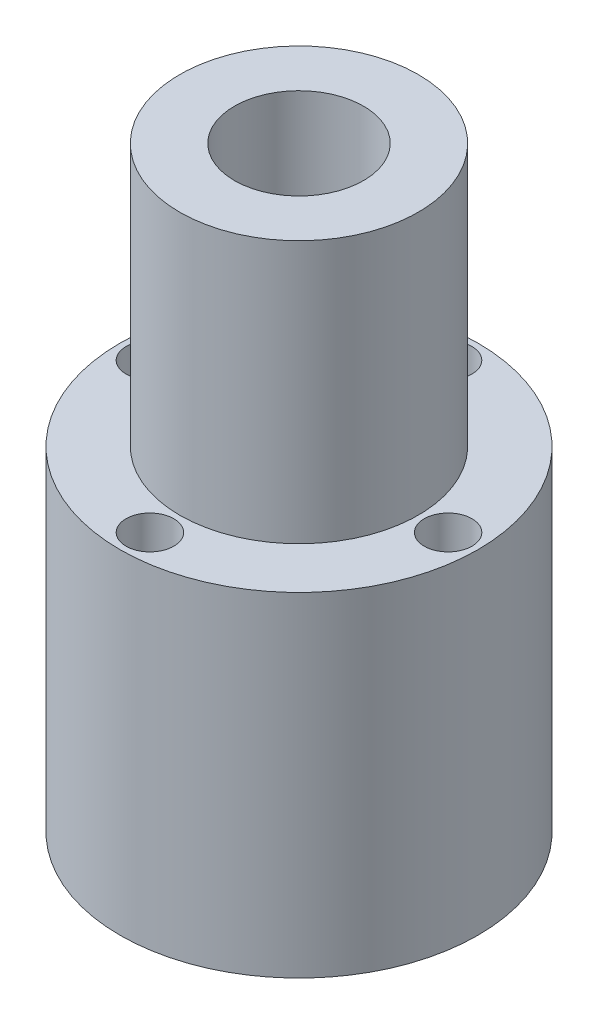
ISO-10303-21;
HEADER;
FILE_DESCRIPTION(('STEP AP214'),'2;1');
FILE_NAME('part.step','',(''),(''),'','','');
FILE_SCHEMA(('AUTOMOTIVE_DESIGN { 1 0 10303 214 1 1 1 1 }'));
ENDSEC;
DATA;
#1=APPLICATION_CONTEXT('core data for automotive mechanical design processes');
#2=APPLICATION_PROTOCOL_DEFINITION('international standard','automotive_design',2000,#1);
#3=PRODUCT_CONTEXT('',#1,'mechanical');
#4=PRODUCT('Part','Part','',(#3));
#5=PRODUCT_RELATED_PRODUCT_CATEGORY('part','',(#4));
#6=PRODUCT_DEFINITION_FORMATION('','',#4);
#7=PRODUCT_DEFINITION_CONTEXT('part definition',#1,'design');
#8=PRODUCT_DEFINITION('design','',#6,#7);
#9=PRODUCT_DEFINITION_SHAPE('','',#8);
#10=(LENGTH_UNIT() NAMED_UNIT(*) SI_UNIT(.MILLI.,.METRE.));
#11=(NAMED_UNIT(*) PLANE_ANGLE_UNIT() SI_UNIT($,.RADIAN.));
#12=(NAMED_UNIT(*) SI_UNIT($,.STERADIAN.) SOLID_ANGLE_UNIT());
#13=UNCERTAINTY_MEASURE_WITH_UNIT(LENGTH_MEASURE(1.E-05),#10,'distance_accuracy_value','');
#14=(GEOMETRIC_REPRESENTATION_CONTEXT(3) GLOBAL_UNCERTAINTY_ASSIGNED_CONTEXT((#13)) GLOBAL_UNIT_ASSIGNED_CONTEXT((#10,
#11,#12)) REPRESENTATION_CONTEXT('',''));
#15=CARTESIAN_POINT('',(0.,0.,0.));
#16=DIRECTION('',(0.,0.,1.));
#17=DIRECTION('',(1.,0.,0.));
#18=AXIS2_PLACEMENT_3D('',#15,#16,#17);
#19=CARTESIAN_POINT('',(0.,11.,0.));
#20=DIRECTION('',(0.,1.,0.));
#21=DIRECTION('',(0.,0.,1.));
#22=AXIS2_PLACEMENT_3D('',#19,#20,#21);
#23=PLANE('',#22);
#24=CARTESIAN_POINT('',(0.,11.,0.));
#25=DIRECTION('',(0.,1.,0.));
#26=DIRECTION('',(0.,0.,1.));
#27=AXIS2_PLACEMENT_3D('',#24,#25,#26);
#28=CIRCLE('',#27,5.);
#29=CARTESIAN_POINT('',(0.,11.,5.));
#30=VERTEX_POINT('',#29);
#31=EDGE_CURVE('E10',#30,#30,#28,.T.);
#32=ORIENTED_EDGE('',*,*,#31,.T.);
#33=EDGE_LOOP('',(#32));
#34=FACE_BOUND('',#33,.T.);
#35=CARTESIAN_POINT('',(0.,11.,0.));
#36=DIRECTION('',(0.,1.,0.));
#37=DIRECTION('',(0.,0.,1.));
#38=AXIS2_PLACEMENT_3D('',#35,#36,#37);
#39=CIRCLE('',#38,2.7051);
#40=CARTESIAN_POINT('',(0.,11.,2.7051));
#41=VERTEX_POINT('',#40);
#42=EDGE_CURVE('E39',#41,#41,#39,.T.);
#43=ORIENTED_EDGE('',*,*,#42,.F.);
#44=EDGE_LOOP('',(#43));
#45=FACE_BOUND('',#44,.T.);
#46=ADVANCED_FACE('F31',(#34,#45),#23,.T.);
#47=CARTESIAN_POINT('',(0.,11.,0.));
#48=DIRECTION('',(0.,-1.,0.));
#49=DIRECTION('',(0.,0.,-1.));
#50=AXIS2_PLACEMENT_3D('',#47,#48,#49);
#51=CYLINDRICAL_SURFACE('',#50,5.);
#52=ORIENTED_EDGE('',*,*,#31,.F.);
#53=EDGE_LOOP('',(#52));
#54=FACE_BOUND('',#53,.T.);
#55=CARTESIAN_POINT('',(0.,0.,0.));
#56=DIRECTION('',(0.,1.,0.));
#57=DIRECTION('',(0.,0.,1.));
#58=AXIS2_PLACEMENT_3D('',#55,#56,#57);
#59=CIRCLE('',#58,5.);
#60=CARTESIAN_POINT('',(0.,0.,5.));
#61=VERTEX_POINT('',#60);
#62=EDGE_CURVE('E47',#61,#61,#59,.T.);
#63=ORIENTED_EDGE('',*,*,#62,.T.);
#64=EDGE_LOOP('',(#63));
#65=FACE_BOUND('',#64,.T.);
#66=ADVANCED_FACE('F33',(#54,#65),#51,.T.);
#67=CARTESIAN_POINT('',(0.,11.,0.));
#68=DIRECTION('',(0.,-1.,0.));
#69=DIRECTION('',(0.,0.,-1.));
#70=AXIS2_PLACEMENT_3D('',#67,#68,#69);
#71=CYLINDRICAL_SURFACE('',#70,2.7051);
#72=ORIENTED_EDGE('',*,*,#42,.T.);
#73=EDGE_LOOP('',(#72));
#74=FACE_BOUND('',#73,.T.);
#75=CARTESIAN_POINT('',(0.,0.,0.));
#76=DIRECTION('',(0.,1.,0.));
#77=DIRECTION('',(0.,0.,1.));
#78=AXIS2_PLACEMENT_3D('',#75,#76,#77);
#79=CIRCLE('',#78,2.7051);
#80=CARTESIAN_POINT('',(0.,0.,2.7051));
#81=VERTEX_POINT('',#80);
#82=EDGE_CURVE('E44',#81,#81,#79,.T.);
#83=ORIENTED_EDGE('',*,*,#82,.F.);
#84=EDGE_LOOP('',(#83));
#85=FACE_BOUND('',#84,.T.);
#86=ADVANCED_FACE('F119',(#74,#85),#71,.F.);
#87=CARTESIAN_POINT('',(0.,0.,0.));
#88=DIRECTION('',(0.,1.,0.));
#89=DIRECTION('',(0.,0.,1.));
#90=AXIS2_PLACEMENT_3D('',#87,#88,#89);
#91=PLANE('',#90);
#92=CARTESIAN_POINT('',(0.,0.,0.));
#93=DIRECTION('',(0.,1.,0.));
#94=DIRECTION('',(0.,0.,1.));
#95=AXIS2_PLACEMENT_3D('',#92,#93,#94);
#96=CIRCLE('',#95,1.75);
#97=CARTESIAN_POINT('',(0.,0.,1.75));
#98=VERTEX_POINT('',#97);
#99=EDGE_CURVE('E59',#98,#98,#96,.T.);
#100=ORIENTED_EDGE('',*,*,#99,.F.);
#101=EDGE_LOOP('',(#100));
#102=FACE_BOUND('',#101,.T.);
#103=ORIENTED_EDGE('',*,*,#82,.T.);
#104=EDGE_LOOP('',(#103));
#105=FACE_BOUND('',#104,.T.);
#106=ADVANCED_FACE('F125',(#102,#105),#91,.T.);
#107=CARTESIAN_POINT('',(0.,-14.,0.));
#108=DIRECTION('',(0.,1.,0.));
#109=DIRECTION('',(0.,0.,1.));
#110=AXIS2_PLACEMENT_3D('',#107,#108,#109);
#111=CYLINDRICAL_SURFACE('',#110,7.5);
#112=CARTESIAN_POINT('',(0.,-14.,0.));
#113=DIRECTION('',(0.,1.,0.));
#114=DIRECTION('',(0.,0.,1.));
#115=AXIS2_PLACEMENT_3D('',#112,#113,#114);
#116=CIRCLE('',#115,7.5);
#117=CARTESIAN_POINT('',(0.,-14.,7.5));
#118=VERTEX_POINT('',#117);
#119=EDGE_CURVE('E49',#118,#118,#116,.T.);
#120=ORIENTED_EDGE('',*,*,#119,.T.);
#121=EDGE_LOOP('',(#120));
#122=FACE_BOUND('',#121,.T.);
#123=CARTESIAN_POINT('',(0.,0.,0.));
#124=DIRECTION('',(0.,1.,0.));
#125=DIRECTION('',(0.,0.,1.));
#126=AXIS2_PLACEMENT_3D('',#123,#124,#125);
#127=CIRCLE('',#126,7.5);
#128=CARTESIAN_POINT('',(0.,0.,7.5));
#129=VERTEX_POINT('',#128);
#130=EDGE_CURVE('E54',#129,#129,#127,.T.);
#131=ORIENTED_EDGE('',*,*,#130,.F.);
#132=EDGE_LOOP('',(#131));
#133=FACE_BOUND('',#132,.T.);
#134=ADVANCED_FACE('F127',(#122,#133),#111,.T.);
#135=CARTESIAN_POINT('',(0.,-14.,0.));
#136=DIRECTION('',(0.,1.,0.));
#137=DIRECTION('',(0.,0.,1.));
#138=AXIS2_PLACEMENT_3D('',#135,#136,#137);
#139=PLANE('',#138);
#140=CARTESIAN_POINT('',(0.,-14.,0.));
#141=DIRECTION('',(0.,1.,0.));
#142=DIRECTION('',(0.,0.,1.));
#143=AXIS2_PLACEMENT_3D('',#140,#141,#142);
#144=CIRCLE('',#143,2.1);
#145=CARTESIAN_POINT('',(0.,-14.,2.1));
#146=VERTEX_POINT('',#145);
#147=EDGE_CURVE('E88',#146,#146,#144,.T.);
#148=ORIENTED_EDGE('',*,*,#147,.T.);
#149=EDGE_LOOP('',(#148));
#150=FACE_BOUND('',#149,.T.);
#151=CARTESIAN_POINT('',(-6.25,-14.,0.));
#152=DIRECTION('',(0.,1.,0.));
#153=DIRECTION('',(0.,0.,1.));
#154=AXIS2_PLACEMENT_3D('',#151,#152,#153);
#155=CIRCLE('',#154,1.);
#156=CARTESIAN_POINT('',(-6.25,-14.,1.));
#157=VERTEX_POINT('',#156);
#158=EDGE_CURVE('E80',#157,#157,#155,.T.);
#159=ORIENTED_EDGE('',*,*,#158,.T.);
#160=EDGE_LOOP('',(#159));
#161=FACE_BOUND('',#160,.T.);
#162=CARTESIAN_POINT('',(0.,-14.,6.25));
#163=DIRECTION('',(0.,1.,0.));
#164=DIRECTION('',(0.,0.,1.));
#165=AXIS2_PLACEMENT_3D('',#162,#163,#164);
#166=CIRCLE('',#165,1.);
#167=CARTESIAN_POINT('',(0.,-14.,7.25));
#168=VERTEX_POINT('',#167);
#169=EDGE_CURVE('E74',#168,#168,#166,.T.);
#170=ORIENTED_EDGE('',*,*,#169,.T.);
#171=EDGE_LOOP('',(#170));
#172=FACE_BOUND('',#171,.T.);
#173=CARTESIAN_POINT('',(6.25,-14.,0.));
#174=DIRECTION('',(0.,1.,0.));
#175=DIRECTION('',(0.,0.,1.));
#176=AXIS2_PLACEMENT_3D('',#173,#174,#175);
#177=CIRCLE('',#176,1.);
#178=CARTESIAN_POINT('',(6.25,-14.,1.));
#179=VERTEX_POINT('',#178);
#180=EDGE_CURVE('E68',#179,#179,#177,.T.);
#181=ORIENTED_EDGE('',*,*,#180,.T.);
#182=EDGE_LOOP('',(#181));
#183=FACE_BOUND('',#182,.T.);
#184=CARTESIAN_POINT('',(0.,-14.,-6.25));
#185=DIRECTION('',(0.,1.,0.));
#186=DIRECTION('',(0.,0.,1.));
#187=AXIS2_PLACEMENT_3D('',#184,#185,#186);
#188=CIRCLE('',#187,1.);
#189=CARTESIAN_POINT('',(0.,-14.,-5.25));
#190=VERTEX_POINT('',#189);
#191=EDGE_CURVE('E64',#190,#190,#188,.T.);
#192=ORIENTED_EDGE('',*,*,#191,.T.);
#193=EDGE_LOOP('',(#192));
#194=FACE_BOUND('',#193,.T.);
#195=ORIENTED_EDGE('',*,*,#119,.F.);
#196=EDGE_LOOP('',(#195));
#197=FACE_BOUND('',#196,.T.);
#198=ADVANCED_FACE('F130',(#150,#161,#172,#183,#194,#197),#139,.F.);
#199=ORIENTED_EDGE('',*,*,#62,.F.);
#200=EDGE_LOOP('',(#199));
#201=FACE_BOUND('',#200,.T.);
#202=CARTESIAN_POINT('',(-6.25,0.,0.));
#203=DIRECTION('',(0.,1.,0.));
#204=DIRECTION('',(0.,0.,1.));
#205=AXIS2_PLACEMENT_3D('',#202,#203,#204);
#206=CIRCLE('',#205,1.);
#207=CARTESIAN_POINT('',(-6.25,0.,1.));
#208=VERTEX_POINT('',#207);
#209=EDGE_CURVE('E83',#208,#208,#206,.T.);
#210=ORIENTED_EDGE('',*,*,#209,.F.);
#211=EDGE_LOOP('',(#210));
#212=FACE_BOUND('',#211,.T.);
#213=CARTESIAN_POINT('',(0.,0.,6.25));
#214=DIRECTION('',(0.,1.,0.));
#215=DIRECTION('',(0.,0.,1.));
#216=AXIS2_PLACEMENT_3D('',#213,#214,#215);
#217=CIRCLE('',#216,1.);
#218=CARTESIAN_POINT('',(0.,0.,7.25));
#219=VERTEX_POINT('',#218);
#220=EDGE_CURVE('E77',#219,#219,#217,.T.);
#221=ORIENTED_EDGE('',*,*,#220,.F.);
#222=EDGE_LOOP('',(#221));
#223=FACE_BOUND('',#222,.T.);
#224=CARTESIAN_POINT('',(6.25,0.,0.));
#225=DIRECTION('',(0.,1.,0.));
#226=DIRECTION('',(0.,0.,1.));
#227=AXIS2_PLACEMENT_3D('',#224,#225,#226);
#228=CIRCLE('',#227,1.);
#229=CARTESIAN_POINT('',(6.25,0.,1.));
#230=VERTEX_POINT('',#229);
#231=EDGE_CURVE('E71',#230,#230,#228,.T.);
#232=ORIENTED_EDGE('',*,*,#231,.F.);
#233=EDGE_LOOP('',(#232));
#234=FACE_BOUND('',#233,.T.);
#235=CARTESIAN_POINT('',(0.,0.,-6.25));
#236=DIRECTION('',(0.,1.,0.));
#237=DIRECTION('',(0.,0.,1.));
#238=AXIS2_PLACEMENT_3D('',#235,#236,#237);
#239=CIRCLE('',#238,1.);
#240=CARTESIAN_POINT('',(0.,0.,-5.25));
#241=VERTEX_POINT('',#240);
#242=EDGE_CURVE('E65',#241,#241,#239,.T.);
#243=ORIENTED_EDGE('',*,*,#242,.F.);
#244=EDGE_LOOP('',(#243));
#245=FACE_BOUND('',#244,.T.);
#246=ORIENTED_EDGE('',*,*,#130,.T.);
#247=EDGE_LOOP('',(#246));
#248=FACE_BOUND('',#247,.T.);
#249=ADVANCED_FACE('F131',(#201,#212,#223,#234,#245,#248),#91,.T.);
#250=CARTESIAN_POINT('',(0.,-14.,0.));
#251=DIRECTION('',(0.,1.,0.));
#252=DIRECTION('',(0.,0.,1.));
#253=AXIS2_PLACEMENT_3D('',#250,#251,#252);
#254=CYLINDRICAL_SURFACE('',#253,1.75);
#255=CARTESIAN_POINT('',(0.,-8.,0.));
#256=DIRECTION('',(0.,1.,0.));
#257=DIRECTION('',(0.,0.,1.));
#258=AXIS2_PLACEMENT_3D('',#255,#256,#257);
#259=CIRCLE('',#258,1.75);
#260=CARTESIAN_POINT('',(0.,-8.,1.75));
#261=VERTEX_POINT('',#260);
#262=EDGE_CURVE('E35',#261,#261,#259,.F.);
#263=ORIENTED_EDGE('',*,*,#262,.T.);
#264=EDGE_LOOP('',(#263));
#265=FACE_BOUND('',#264,.T.);
#266=ORIENTED_EDGE('',*,*,#99,.T.);
#267=EDGE_LOOP('',(#266));
#268=FACE_BOUND('',#267,.T.);
#269=ADVANCED_FACE('F98',(#265,#268),#254,.F.);
#270=CARTESIAN_POINT('',(0.,-14.,-6.25));
#271=DIRECTION('',(0.,1.,0.));
#272=DIRECTION('',(0.,0.,1.));
#273=AXIS2_PLACEMENT_3D('',#270,#271,#272);
#274=CYLINDRICAL_SURFACE('',#273,1.);
#275=ORIENTED_EDGE('',*,*,#191,.F.);
#276=EDGE_LOOP('',(#275));
#277=FACE_BOUND('',#276,.T.);
#278=ORIENTED_EDGE('',*,*,#242,.T.);
#279=EDGE_LOOP('',(#278));
#280=FACE_BOUND('',#279,.T.);
#281=ADVANCED_FACE('F140',(#277,#280),#274,.F.);
#282=CARTESIAN_POINT('',(6.25,-14.,0.));
#283=DIRECTION('',(0.,1.,0.));
#284=DIRECTION('',(0.,0.,1.));
#285=AXIS2_PLACEMENT_3D('',#282,#283,#284);
#286=CYLINDRICAL_SURFACE('',#285,1.);
#287=ORIENTED_EDGE('',*,*,#180,.F.);
#288=EDGE_LOOP('',(#287));
#289=FACE_BOUND('',#288,.T.);
#290=ORIENTED_EDGE('',*,*,#231,.T.);
#291=EDGE_LOOP('',(#290));
#292=FACE_BOUND('',#291,.T.);
#293=ADVANCED_FACE('F143',(#289,#292),#286,.F.);
#294=CARTESIAN_POINT('',(0.,-14.,6.25));
#295=DIRECTION('',(0.,1.,0.));
#296=DIRECTION('',(0.,0.,1.));
#297=AXIS2_PLACEMENT_3D('',#294,#295,#296);
#298=CYLINDRICAL_SURFACE('',#297,1.);
#299=ORIENTED_EDGE('',*,*,#169,.F.);
#300=EDGE_LOOP('',(#299));
#301=FACE_BOUND('',#300,.T.);
#302=ORIENTED_EDGE('',*,*,#220,.T.);
#303=EDGE_LOOP('',(#302));
#304=FACE_BOUND('',#303,.T.);
#305=ADVANCED_FACE('F112',(#301,#304),#298,.F.);
#306=CARTESIAN_POINT('',(-6.25,-14.,0.));
#307=DIRECTION('',(0.,1.,0.));
#308=DIRECTION('',(0.,0.,1.));
#309=AXIS2_PLACEMENT_3D('',#306,#307,#308);
#310=CYLINDRICAL_SURFACE('',#309,1.);
#311=ORIENTED_EDGE('',*,*,#158,.F.);
#312=EDGE_LOOP('',(#311));
#313=FACE_BOUND('',#312,.T.);
#314=ORIENTED_EDGE('',*,*,#209,.T.);
#315=EDGE_LOOP('',(#314));
#316=FACE_BOUND('',#315,.T.);
#317=ADVANCED_FACE('F104',(#313,#316),#310,.F.);
#318=CARTESIAN_POINT('',(0.,-8.,0.));
#319=DIRECTION('',(0.,1.,0.));
#320=DIRECTION('',(0.,0.,1.));
#321=AXIS2_PLACEMENT_3D('',#318,#319,#320);
#322=PLANE('',#321);
#323=CARTESIAN_POINT('',(0.,-8.,0.));
#324=DIRECTION('',(0.,1.,0.));
#325=DIRECTION('',(0.,0.,1.));
#326=AXIS2_PLACEMENT_3D('',#323,#324,#325);
#327=CIRCLE('',#326,2.1);
#328=CARTESIAN_POINT('',(0.,-8.,2.1));
#329=VERTEX_POINT('',#328);
#330=EDGE_CURVE('E91',#329,#329,#327,.T.);
#331=ORIENTED_EDGE('',*,*,#330,.F.);
#332=EDGE_LOOP('',(#331));
#333=FACE_BOUND('',#332,.T.);
#334=ORIENTED_EDGE('',*,*,#262,.F.);
#335=EDGE_LOOP('',(#334));
#336=FACE_BOUND('',#335,.T.);
#337=ADVANCED_FACE('F101',(#333,#336),#322,.F.);
#338=CARTESIAN_POINT('',(0.,-8.,0.));
#339=DIRECTION('',(0.,-1.,0.));
#340=DIRECTION('',(0.,0.,-1.));
#341=AXIS2_PLACEMENT_3D('',#338,#339,#340);
#342=CYLINDRICAL_SURFACE('',#341,2.1);
#343=ORIENTED_EDGE('',*,*,#330,.T.);
#344=EDGE_LOOP('',(#343));
#345=FACE_BOUND('',#344,.T.);
#346=ORIENTED_EDGE('',*,*,#147,.F.);
#347=EDGE_LOOP('',(#346));
#348=FACE_BOUND('',#347,.T.);
#349=ADVANCED_FACE('F103',(#345,#348),#342,.F.);
#350=CLOSED_SHELL('',(#46,#66,#86,#106,#134,#198,#249,#269,#281,#293,#305,#317,#337,#349));
#351=MANIFOLD_SOLID_BREP('B2',#350);
#352=ADVANCED_BREP_SHAPE_REPRESENTATION('',(#18,#351),#14);
#353=SHAPE_DEFINITION_REPRESENTATION(#9,#352);
ENDSEC;
END-ISO-10303-21;
